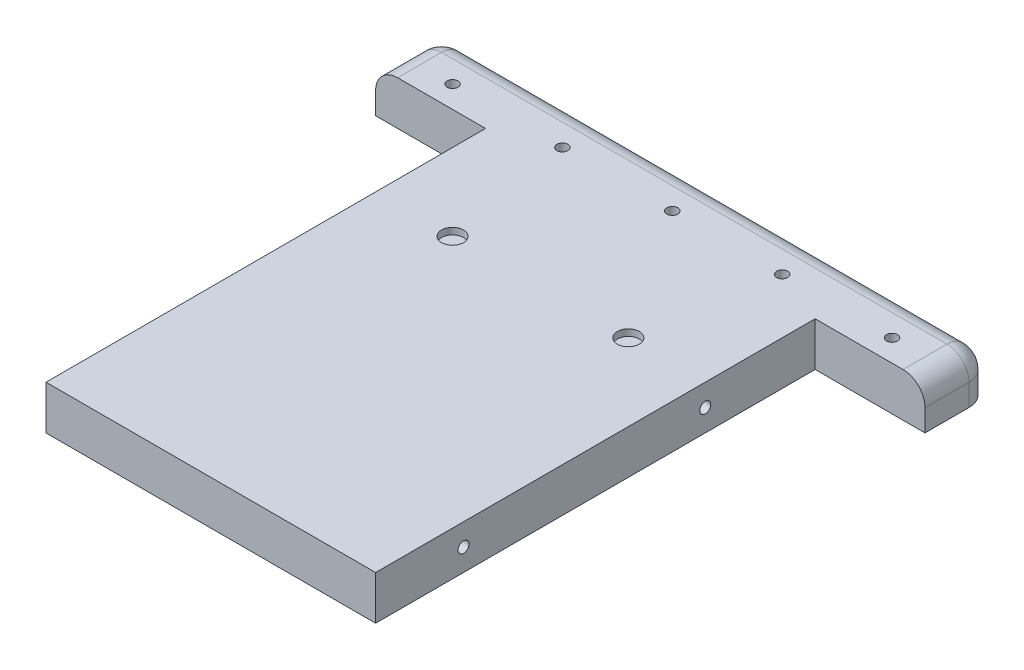
ISO-10303-21;
HEADER;
FILE_DESCRIPTION(('STEP AP214'),'2;1');
FILE_NAME('part.step','',(''),(''),'','','');
FILE_SCHEMA(('AUTOMOTIVE_DESIGN { 1 0 10303 214 1 1 1 1 }'));
ENDSEC;
DATA;
#1=APPLICATION_CONTEXT('core data for automotive mechanical design processes');
#2=APPLICATION_PROTOCOL_DEFINITION('international standard','automotive_design',2000,#1);
#3=PRODUCT_CONTEXT('',#1,'mechanical');
#4=PRODUCT('Part','Part','',(#3));
#5=PRODUCT_RELATED_PRODUCT_CATEGORY('part','',(#4));
#6=PRODUCT_DEFINITION_FORMATION('','',#4);
#7=PRODUCT_DEFINITION_CONTEXT('part definition',#1,'design');
#8=PRODUCT_DEFINITION('design','',#6,#7);
#9=PRODUCT_DEFINITION_SHAPE('','',#8);
#10=(LENGTH_UNIT() NAMED_UNIT(*) SI_UNIT(.MILLI.,.METRE.));
#11=(NAMED_UNIT(*) PLANE_ANGLE_UNIT() SI_UNIT($,.RADIAN.));
#12=(NAMED_UNIT(*) SI_UNIT($,.STERADIAN.) SOLID_ANGLE_UNIT());
#13=UNCERTAINTY_MEASURE_WITH_UNIT(LENGTH_MEASURE(1.E-05),#10,'distance_accuracy_value','');
#14=(GEOMETRIC_REPRESENTATION_CONTEXT(3) GLOBAL_UNCERTAINTY_ASSIGNED_CONTEXT((#13)) GLOBAL_UNIT_ASSIGNED_CONTEXT((#10,
#11,#12)) REPRESENTATION_CONTEXT('',''));
#15=CARTESIAN_POINT('',(0.,0.,0.));
#16=DIRECTION('',(0.,0.,1.));
#17=DIRECTION('',(1.,0.,0.));
#18=AXIS2_PLACEMENT_3D('',#15,#16,#17);
#19=CARTESIAN_POINT('',(-75.,20.,-100.));
#20=DIRECTION('',(1.,0.,0.));
#21=DIRECTION('',(0.,0.,-1.));
#22=AXIS2_PLACEMENT_3D('',#19,#20,#21);
#23=PLANE('',#22);
#24=CARTESIAN_POINT('',(-75.,10.,60.));
#25=DIRECTION('',(-1.,0.,0.));
#26=DIRECTION('',(0.,0.,1.));
#27=AXIS2_PLACEMENT_3D('',#24,#25,#26);
#28=CIRCLE('',#27,2.49999999999999);
#29=CARTESIAN_POINT('',(-75.,10.,62.5));
#30=VERTEX_POINT('',#29);
#31=EDGE_CURVE('E162',#30,#30,#28,.T.);
#32=ORIENTED_EDGE('',*,*,#31,.F.);
#33=EDGE_LOOP('',(#32));
#34=FACE_BOUND('',#33,.T.);
#35=CARTESIAN_POINT('',(-75.,10.,-50.));
#36=DIRECTION('',(-1.,0.,0.));
#37=DIRECTION('',(0.,0.,1.));
#38=AXIS2_PLACEMENT_3D('',#35,#36,#37);
#39=CIRCLE('',#38,2.49999999999999);
#40=CARTESIAN_POINT('',(-75.,10.,-47.5));
#41=VERTEX_POINT('',#40);
#42=EDGE_CURVE('E219',#41,#41,#39,.T.);
#43=ORIENTED_EDGE('',*,*,#42,.F.);
#44=EDGE_LOOP('',(#43));
#45=FACE_BOUND('',#44,.T.);
#46=DIRECTION('',(0.,0.,1.));
#47=VECTOR('',#46,1.);
#48=CARTESIAN_POINT('',(-75.,0.,-100.));
#49=LINE('',#48,#47);
#50=CARTESIAN_POINT('',(-75.,0.,-100.));
#51=VERTEX_POINT('',#50);
#52=CARTESIAN_POINT('',(-75.,0.,100.));
#53=VERTEX_POINT('',#52);
#54=EDGE_CURVE('E149',#51,#53,#49,.T.);
#55=ORIENTED_EDGE('',*,*,#54,.T.);
#56=DIRECTION('',(0.,-1.,0.));
#57=VECTOR('',#56,1.);
#58=CARTESIAN_POINT('',(-75.,20.,100.));
#59=LINE('',#58,#57);
#60=CARTESIAN_POINT('',(-75.,20.,100.));
#61=VERTEX_POINT('',#60);
#62=EDGE_CURVE('E129',#61,#53,#59,.T.);
#63=ORIENTED_EDGE('',*,*,#62,.F.);
#64=DIRECTION('',(0.,0.,1.));
#65=VECTOR('',#64,1.);
#66=CARTESIAN_POINT('',(-75.,20.,-100.));
#67=LINE('',#66,#65);
#68=CARTESIAN_POINT('',(-75.,20.,-100.));
#69=VERTEX_POINT('',#68);
#70=EDGE_CURVE('E136',#69,#61,#67,.T.);
#71=ORIENTED_EDGE('',*,*,#70,.F.);
#72=DIRECTION('',(0.,-1.,0.));
#73=VECTOR('',#72,1.);
#74=CARTESIAN_POINT('',(-75.,20.,-100.));
#75=LINE('',#74,#73);
#76=EDGE_CURVE('E227',#69,#51,#75,.T.);
#77=ORIENTED_EDGE('',*,*,#76,.T.);
#78=EDGE_LOOP('',(#55,#63,#71,#77));
#79=FACE_BOUND('',#78,.T.);
#80=ADVANCED_FACE('F34',(#34,#45,#79),#23,.F.);
#81=CARTESIAN_POINT('',(-75.,20.,100.));
#82=DIRECTION('',(0.,0.,-1.));
#83=DIRECTION('',(-1.,0.,0.));
#84=AXIS2_PLACEMENT_3D('',#81,#82,#83);
#85=PLANE('',#84);
#86=DIRECTION('',(1.,0.,0.));
#87=VECTOR('',#86,1.);
#88=CARTESIAN_POINT('',(-75.,0.,100.));
#89=LINE('',#88,#87);
#90=CARTESIAN_POINT('',(75.,0.,100.));
#91=VERTEX_POINT('',#90);
#92=EDGE_CURVE('E229',#53,#91,#89,.T.);
#93=ORIENTED_EDGE('',*,*,#92,.T.);
#94=DIRECTION('',(0.,-1.,0.));
#95=VECTOR('',#94,1.);
#96=CARTESIAN_POINT('',(75.,20.,100.));
#97=LINE('',#96,#95);
#98=CARTESIAN_POINT('',(75.,20.,100.));
#99=VERTEX_POINT('',#98);
#100=EDGE_CURVE('E132',#99,#91,#97,.T.);
#101=ORIENTED_EDGE('',*,*,#100,.F.);
#102=DIRECTION('',(1.,0.,0.));
#103=VECTOR('',#102,1.);
#104=CARTESIAN_POINT('',(-75.,20.,100.));
#105=LINE('',#104,#103);
#106=EDGE_CURVE('E125',#61,#99,#105,.T.);
#107=ORIENTED_EDGE('',*,*,#106,.F.);
#108=ORIENTED_EDGE('',*,*,#62,.T.);
#109=EDGE_LOOP('',(#93,#101,#107,#108));
#110=FACE_BOUND('',#109,.T.);
#111=ADVANCED_FACE('F127',(#110),#85,.F.);
#112=CARTESIAN_POINT('',(75.,20.,100.));
#113=DIRECTION('',(-1.,0.,0.));
#114=DIRECTION('',(0.,0.,1.));
#115=AXIS2_PLACEMENT_3D('',#112,#113,#114);
#116=PLANE('',#115);
#117=CARTESIAN_POINT('',(75.,10.,60.));
#118=DIRECTION('',(-1.,0.,0.));
#119=DIRECTION('',(0.,0.,1.));
#120=AXIS2_PLACEMENT_3D('',#117,#118,#119);
#121=CIRCLE('',#120,2.49999999999999);
#122=CARTESIAN_POINT('',(75.,10.,62.5));
#123=VERTEX_POINT('',#122);
#124=EDGE_CURVE('E161',#123,#123,#121,.T.);
#125=ORIENTED_EDGE('',*,*,#124,.T.);
#126=EDGE_LOOP('',(#125));
#127=FACE_BOUND('',#126,.T.);
#128=CARTESIAN_POINT('',(75.,10.,-50.));
#129=DIRECTION('',(-1.,0.,0.));
#130=DIRECTION('',(0.,0.,1.));
#131=AXIS2_PLACEMENT_3D('',#128,#129,#130);
#132=CIRCLE('',#131,2.49999999999999);
#133=CARTESIAN_POINT('',(75.,10.,-47.5));
#134=VERTEX_POINT('',#133);
#135=EDGE_CURVE('E158',#134,#134,#132,.T.);
#136=ORIENTED_EDGE('',*,*,#135,.T.);
#137=EDGE_LOOP('',(#136));
#138=FACE_BOUND('',#137,.T.);
#139=DIRECTION('',(0.,0.,-1.));
#140=VECTOR('',#139,1.);
#141=CARTESIAN_POINT('',(75.,0.,100.));
#142=LINE('',#141,#140);
#143=CARTESIAN_POINT('',(75.,0.,-100.));
#144=VERTEX_POINT('',#143);
#145=EDGE_CURVE('E231',#91,#144,#142,.T.);
#146=ORIENTED_EDGE('',*,*,#145,.T.);
#147=DIRECTION('',(0.,-1.,0.));
#148=VECTOR('',#147,1.);
#149=CARTESIAN_POINT('',(75.,20.,-100.));
#150=LINE('',#149,#148);
#151=CARTESIAN_POINT('',(75.,20.,-100.));
#152=VERTEX_POINT('',#151);
#153=EDGE_CURVE('E154',#152,#144,#150,.T.);
#154=ORIENTED_EDGE('',*,*,#153,.F.);
#155=DIRECTION('',(0.,0.,-1.));
#156=VECTOR('',#155,1.);
#157=CARTESIAN_POINT('',(75.,20.,100.));
#158=LINE('',#157,#156);
#159=EDGE_CURVE('E135',#99,#152,#158,.T.);
#160=ORIENTED_EDGE('',*,*,#159,.F.);
#161=ORIENTED_EDGE('',*,*,#100,.T.);
#162=EDGE_LOOP('',(#146,#154,#160,#161));
#163=FACE_BOUND('',#162,.T.);
#164=ADVANCED_FACE('F280',(#127,#138,#163),#116,.F.);
#165=CARTESIAN_POINT('',(75.,20.,-100.));
#166=DIRECTION('',(0.,0.,-1.));
#167=DIRECTION('',(-1.,0.,0.));
#168=AXIS2_PLACEMENT_3D('',#165,#166,#167);
#169=PLANE('',#168);
#170=DIRECTION('',(0.,-1.,0.));
#171=VECTOR('',#170,1.);
#172=CARTESIAN_POINT('',(125.,20.,-100.));
#173=LINE('',#172,#171);
#174=CARTESIAN_POINT('',(125.,10.,-100.));
#175=VERTEX_POINT('',#174);
#176=CARTESIAN_POINT('',(125.,0.,-100.));
#177=VERTEX_POINT('',#176);
#178=EDGE_CURVE('E249',#175,#177,#173,.T.);
#179=ORIENTED_EDGE('',*,*,#178,.F.);
#180=CARTESIAN_POINT('',(115.,10.,-100.));
#181=DIRECTION('',(0.,0.,-1.));
#182=DIRECTION('',(-1.,0.,0.));
#183=AXIS2_PLACEMENT_3D('',#180,#181,#182);
#184=CIRCLE('',#183,10.);
#185=CARTESIAN_POINT('',(115.,20.,-100.));
#186=VERTEX_POINT('',#185);
#187=EDGE_CURVE('E184',#175,#186,#184,.F.);
#188=ORIENTED_EDGE('',*,*,#187,.T.);
#189=DIRECTION('',(1.,0.,0.));
#190=VECTOR('',#189,1.);
#191=CARTESIAN_POINT('',(75.,20.,-100.));
#192=LINE('',#191,#190);
#193=EDGE_CURVE('E224',#152,#186,#192,.T.);
#194=ORIENTED_EDGE('',*,*,#193,.F.);
#195=ORIENTED_EDGE('',*,*,#153,.T.);
#196=DIRECTION('',(1.,0.,0.));
#197=VECTOR('',#196,1.);
#198=CARTESIAN_POINT('',(75.,0.,-100.));
#199=LINE('',#198,#197);
#200=EDGE_CURVE('E233',#144,#177,#199,.T.);
#201=ORIENTED_EDGE('',*,*,#200,.T.);
#202=EDGE_LOOP('',(#179,#188,#194,#195,#201));
#203=FACE_BOUND('',#202,.T.);
#204=ADVANCED_FACE('F256',(#203),#169,.F.);
#205=CARTESIAN_POINT('',(125.,20.,-100.));
#206=DIRECTION('',(-1.,0.,0.));
#207=DIRECTION('',(0.,0.,1.));
#208=AXIS2_PLACEMENT_3D('',#205,#206,#207);
#209=PLANE('',#208);
#210=DIRECTION('',(0.,-1.,0.));
#211=VECTOR('',#210,1.);
#212=CARTESIAN_POINT('',(125.,20.,-120.));
#213=LINE('',#212,#211);
#214=CARTESIAN_POINT('',(125.,0.,-120.));
#215=VERTEX_POINT('',#214);
#216=CARTESIAN_POINT('',(125.,10.,-120.));
#217=VERTEX_POINT('',#216);
#218=EDGE_CURVE('E170',#215,#217,#213,.F.);
#219=ORIENTED_EDGE('',*,*,#218,.T.);
#220=DIRECTION('',(0.,0.,-1.));
#221=VECTOR('',#220,1.);
#222=CARTESIAN_POINT('',(125.,10.,-100.));
#223=LINE('',#222,#221);
#224=EDGE_CURVE('E182',#217,#175,#223,.F.);
#225=ORIENTED_EDGE('',*,*,#224,.T.);
#226=ORIENTED_EDGE('',*,*,#178,.T.);
#227=DIRECTION('',(0.,0.,-1.));
#228=VECTOR('',#227,1.);
#229=CARTESIAN_POINT('',(125.,0.,-100.));
#230=LINE('',#229,#228);
#231=EDGE_CURVE('E236',#177,#215,#230,.T.);
#232=ORIENTED_EDGE('',*,*,#231,.T.);
#233=EDGE_LOOP('',(#219,#225,#226,#232));
#234=FACE_BOUND('',#233,.T.);
#235=ADVANCED_FACE('F266',(#234),#209,.F.);
#236=CARTESIAN_POINT('',(125.,20.,-130.));
#237=DIRECTION('',(0.,0.,1.));
#238=DIRECTION('',(1.,0.,0.));
#239=AXIS2_PLACEMENT_3D('',#236,#237,#238);
#240=PLANE('',#239);
#241=DIRECTION('',(0.,-1.,0.));
#242=VECTOR('',#241,1.);
#243=CARTESIAN_POINT('',(-115.,20.,-130.));
#244=LINE('',#243,#242);
#245=CARTESIAN_POINT('',(-115.,0.,-130.));
#246=VERTEX_POINT('',#245);
#247=CARTESIAN_POINT('',(-115.,10.,-130.));
#248=VERTEX_POINT('',#247);
#249=EDGE_CURVE('E150',#246,#248,#244,.F.);
#250=ORIENTED_EDGE('',*,*,#249,.T.);
#251=DIRECTION('',(-1.,0.,0.));
#252=VECTOR('',#251,1.);
#253=CARTESIAN_POINT('',(115.,10.,-130.));
#254=LINE('',#253,#252);
#255=CARTESIAN_POINT('',(115.,10.,-130.));
#256=VERTEX_POINT('',#255);
#257=EDGE_CURVE('E11',#248,#256,#254,.F.);
#258=ORIENTED_EDGE('',*,*,#257,.T.);
#259=DIRECTION('',(0.,-1.,0.));
#260=VECTOR('',#259,1.);
#261=CARTESIAN_POINT('',(115.,20.,-130.));
#262=LINE('',#261,#260);
#263=CARTESIAN_POINT('',(115.,0.,-130.));
#264=VERTEX_POINT('',#263);
#265=EDGE_CURVE('E152',#256,#264,#262,.T.);
#266=ORIENTED_EDGE('',*,*,#265,.T.);
#267=DIRECTION('',(-1.,0.,0.));
#268=VECTOR('',#267,1.);
#269=CARTESIAN_POINT('',(125.,0.,-130.));
#270=LINE('',#269,#268);
#271=EDGE_CURVE('E239',#264,#246,#270,.T.);
#272=ORIENTED_EDGE('',*,*,#271,.T.);
#273=EDGE_LOOP('',(#250,#258,#266,#272));
#274=FACE_BOUND('',#273,.T.);
#275=ADVANCED_FACE('F319',(#274),#240,.F.);
#276=CARTESIAN_POINT('',(-125.,20.,-130.));
#277=DIRECTION('',(1.,0.,0.));
#278=DIRECTION('',(0.,0.,-1.));
#279=AXIS2_PLACEMENT_3D('',#276,#277,#278);
#280=PLANE('',#279);
#281=DIRECTION('',(0.,-1.,0.));
#282=VECTOR('',#281,1.);
#283=CARTESIAN_POINT('',(-125.,20.,-100.));
#284=LINE('',#283,#282);
#285=CARTESIAN_POINT('',(-125.,10.,-100.));
#286=VERTEX_POINT('',#285);
#287=CARTESIAN_POINT('',(-125.,0.,-100.));
#288=VERTEX_POINT('',#287);
#289=EDGE_CURVE('E247',#286,#288,#284,.T.);
#290=ORIENTED_EDGE('',*,*,#289,.F.);
#291=DIRECTION('',(0.,0.,1.));
#292=VECTOR('',#291,1.);
#293=CARTESIAN_POINT('',(-125.,10.,-120.));
#294=LINE('',#293,#292);
#295=CARTESIAN_POINT('',(-125.,10.,-120.));
#296=VERTEX_POINT('',#295);
#297=EDGE_CURVE('E58',#286,#296,#294,.F.);
#298=ORIENTED_EDGE('',*,*,#297,.T.);
#299=DIRECTION('',(0.,-1.,0.));
#300=VECTOR('',#299,1.);
#301=CARTESIAN_POINT('',(-125.,20.,-120.));
#302=LINE('',#301,#300);
#303=CARTESIAN_POINT('',(-125.,0.,-120.));
#304=VERTEX_POINT('',#303);
#305=EDGE_CURVE('E173',#296,#304,#302,.T.);
#306=ORIENTED_EDGE('',*,*,#305,.T.);
#307=DIRECTION('',(0.,0.,1.));
#308=VECTOR('',#307,1.);
#309=CARTESIAN_POINT('',(-125.,0.,-130.));
#310=LINE('',#309,#308);
#311=EDGE_CURVE('E242',#304,#288,#310,.T.);
#312=ORIENTED_EDGE('',*,*,#311,.T.);
#313=EDGE_LOOP('',(#290,#298,#306,#312));
#314=FACE_BOUND('',#313,.T.);
#315=ADVANCED_FACE('F323',(#314),#280,.F.);
#316=CARTESIAN_POINT('',(-125.,20.,-100.));
#317=DIRECTION('',(0.,0.,-1.));
#318=DIRECTION('',(-1.,0.,0.));
#319=AXIS2_PLACEMENT_3D('',#316,#317,#318);
#320=PLANE('',#319);
#321=DIRECTION('',(1.,0.,0.));
#322=VECTOR('',#321,1.);
#323=CARTESIAN_POINT('',(-125.,20.,-100.));
#324=LINE('',#323,#322);
#325=CARTESIAN_POINT('',(-115.,20.,-100.));
#326=VERTEX_POINT('',#325);
#327=EDGE_CURVE('E142',#326,#69,#324,.T.);
#328=ORIENTED_EDGE('',*,*,#327,.F.);
#329=CARTESIAN_POINT('',(-115.,10.,-100.));
#330=DIRECTION('',(0.,0.,-1.));
#331=DIRECTION('',(-1.,0.,0.));
#332=AXIS2_PLACEMENT_3D('',#329,#330,#331);
#333=CIRCLE('',#332,10.);
#334=EDGE_CURVE('E188',#326,#286,#333,.F.);
#335=ORIENTED_EDGE('',*,*,#334,.T.);
#336=ORIENTED_EDGE('',*,*,#289,.T.);
#337=DIRECTION('',(1.,0.,0.));
#338=VECTOR('',#337,1.);
#339=CARTESIAN_POINT('',(-125.,0.,-100.));
#340=LINE('',#339,#338);
#341=EDGE_CURVE('E146',#288,#51,#340,.T.);
#342=ORIENTED_EDGE('',*,*,#341,.T.);
#343=ORIENTED_EDGE('',*,*,#76,.F.);
#344=EDGE_LOOP('',(#328,#335,#336,#342,#343));
#345=FACE_BOUND('',#344,.T.);
#346=ADVANCED_FACE('F327',(#345),#320,.F.);
#347=CARTESIAN_POINT('',(0.,20.,0.));
#348=DIRECTION('',(0.,1.,0.));
#349=DIRECTION('',(0.,0.,1.));
#350=AXIS2_PLACEMENT_3D('',#347,#348,#349);
#351=PLANE('',#350);
#352=CARTESIAN_POINT('',(-40.,20.,-50.));
#353=DIRECTION('',(0.,1.,0.));
#354=DIRECTION('',(0.,0.,1.));
#355=AXIS2_PLACEMENT_3D('',#352,#353,#354);
#356=CIRCLE('',#355,5.);
#357=CARTESIAN_POINT('',(-40.,20.,-45.));
#358=VERTEX_POINT('',#357);
#359=EDGE_CURVE('E675',#358,#358,#356,.T.);
#360=ORIENTED_EDGE('',*,*,#359,.F.);
#361=EDGE_LOOP('',(#360));
#362=FACE_BOUND('',#361,.T.);
#363=CARTESIAN_POINT('',(40.,20.,-50.));
#364=DIRECTION('',(0.,1.,0.));
#365=DIRECTION('',(0.,0.,-1.));
#366=AXIS2_PLACEMENT_3D('',#363,#364,#365);
#367=CIRCLE('',#366,5.);
#368=CARTESIAN_POINT('',(40.,20.,-55.));
#369=VERTEX_POINT('',#368);
#370=EDGE_CURVE('E669',#369,#369,#367,.T.);
#371=ORIENTED_EDGE('',*,*,#370,.F.);
#372=EDGE_LOOP('',(#371));
#373=FACE_BOUND('',#372,.T.);
#374=CARTESIAN_POINT('',(-100.,20.,-110.));
#375=DIRECTION('',(0.,1.,0.));
#376=DIRECTION('',(0.,0.,-1.));
#377=AXIS2_PLACEMENT_3D('',#374,#375,#376);
#378=CIRCLE('',#377,2.50000000000001);
#379=CARTESIAN_POINT('',(-100.,20.,-112.5));
#380=VERTEX_POINT('',#379);
#381=EDGE_CURVE('E645',#380,#380,#378,.T.);
#382=ORIENTED_EDGE('',*,*,#381,.F.);
#383=EDGE_LOOP('',(#382));
#384=FACE_BOUND('',#383,.T.);
#385=CARTESIAN_POINT('',(-50.,20.,-110.));
#386=DIRECTION('',(0.,1.,0.));
#387=DIRECTION('',(0.,0.,-1.));
#388=AXIS2_PLACEMENT_3D('',#385,#386,#387);
#389=CIRCLE('',#388,2.5);
#390=CARTESIAN_POINT('',(-50.,20.,-112.5));
#391=VERTEX_POINT('',#390);
#392=EDGE_CURVE('E652',#391,#391,#389,.T.);
#393=ORIENTED_EDGE('',*,*,#392,.F.);
#394=EDGE_LOOP('',(#393));
#395=FACE_BOUND('',#394,.T.);
#396=CARTESIAN_POINT('',(100.,20.,-110.));
#397=DIRECTION('',(0.,1.,0.));
#398=DIRECTION('',(0.,0.,1.));
#399=AXIS2_PLACEMENT_3D('',#396,#397,#398);
#400=CIRCLE('',#399,2.50000000000001);
#401=CARTESIAN_POINT('',(100.,20.,-107.5));
#402=VERTEX_POINT('',#401);
#403=EDGE_CURVE('E658',#402,#402,#400,.T.);
#404=ORIENTED_EDGE('',*,*,#403,.F.);
#405=EDGE_LOOP('',(#404));
#406=FACE_BOUND('',#405,.T.);
#407=CARTESIAN_POINT('',(50.,20.,-110.));
#408=DIRECTION('',(0.,1.,0.));
#409=DIRECTION('',(0.,0.,1.));
#410=AXIS2_PLACEMENT_3D('',#407,#408,#409);
#411=CIRCLE('',#410,2.5);
#412=CARTESIAN_POINT('',(50.,20.,-107.5));
#413=VERTEX_POINT('',#412);
#414=EDGE_CURVE('E664',#413,#413,#411,.T.);
#415=ORIENTED_EDGE('',*,*,#414,.F.);
#416=EDGE_LOOP('',(#415));
#417=FACE_BOUND('',#416,.T.);
#418=CARTESIAN_POINT('',(0.,20.,-110.));
#419=DIRECTION('',(0.,1.,0.));
#420=DIRECTION('',(0.,0.,1.));
#421=AXIS2_PLACEMENT_3D('',#418,#419,#420);
#422=CIRCLE('',#421,2.5);
#423=CARTESIAN_POINT('',(0.,20.,-107.5));
#424=VERTEX_POINT('',#423);
#425=EDGE_CURVE('E639',#424,#424,#422,.T.);
#426=ORIENTED_EDGE('',*,*,#425,.F.);
#427=EDGE_LOOP('',(#426));
#428=FACE_BOUND('',#427,.T.);
#429=ORIENTED_EDGE('',*,*,#193,.T.);
#430=DIRECTION('',(0.,0.,-1.));
#431=VECTOR('',#430,1.);
#432=CARTESIAN_POINT('',(115.,20.,-120.));
#433=LINE('',#432,#431);
#434=CARTESIAN_POINT('',(115.,20.,-120.));
#435=VERTEX_POINT('',#434);
#436=EDGE_CURVE('E179',#186,#435,#433,.T.);
#437=ORIENTED_EDGE('',*,*,#436,.T.);
#438=DIRECTION('',(-1.,0.,0.));
#439=VECTOR('',#438,1.);
#440=CARTESIAN_POINT('',(-115.,20.,-120.));
#441=LINE('',#440,#439);
#442=CARTESIAN_POINT('',(-115.,20.,-120.));
#443=VERTEX_POINT('',#442);
#444=EDGE_CURVE('E175',#435,#443,#441,.T.);
#445=ORIENTED_EDGE('',*,*,#444,.T.);
#446=DIRECTION('',(0.,0.,1.));
#447=VECTOR('',#446,1.);
#448=CARTESIAN_POINT('',(-115.,20.,-100.));
#449=LINE('',#448,#447);
#450=EDGE_CURVE('E177',#443,#326,#449,.T.);
#451=ORIENTED_EDGE('',*,*,#450,.T.);
#452=ORIENTED_EDGE('',*,*,#327,.T.);
#453=ORIENTED_EDGE('',*,*,#70,.T.);
#454=ORIENTED_EDGE('',*,*,#106,.T.);
#455=ORIENTED_EDGE('',*,*,#159,.T.);
#456=EDGE_LOOP('',(#429,#437,#445,#451,#452,#453,#454,#455));
#457=FACE_BOUND('',#456,.T.);
#458=ADVANCED_FACE('F140',(#362,#373,#384,#395,#406,#417,#428,#457),#351,.T.);
#459=CARTESIAN_POINT('',(0.,0.,0.));
#460=DIRECTION('',(0.,1.,0.));
#461=DIRECTION('',(0.,0.,1.));
#462=AXIS2_PLACEMENT_3D('',#459,#460,#461);
#463=PLANE('',#462);
#464=CARTESIAN_POINT('',(-100.,0.,-115.));
#465=DIRECTION('',(0.,-1.,0.));
#466=DIRECTION('',(0.,0.,-1.));
#467=AXIS2_PLACEMENT_3D('',#464,#465,#466);
#468=CIRCLE('',#467,2.5);
#469=CARTESIAN_POINT('',(-100.,0.,-117.5));
#470=VERTEX_POINT('',#469);
#471=EDGE_CURVE('E611',#470,#470,#468,.T.);
#472=ORIENTED_EDGE('',*,*,#471,.F.);
#473=EDGE_LOOP('',(#472));
#474=FACE_BOUND('',#473,.T.);
#475=CARTESIAN_POINT('',(-50.,0.,-115.));
#476=DIRECTION('',(0.,-1.,0.));
#477=DIRECTION('',(0.,0.,-1.));
#478=AXIS2_PLACEMENT_3D('',#475,#476,#477);
#479=CIRCLE('',#478,2.5);
#480=CARTESIAN_POINT('',(-50.,0.,-117.5));
#481=VERTEX_POINT('',#480);
#482=EDGE_CURVE('E615',#481,#481,#479,.T.);
#483=ORIENTED_EDGE('',*,*,#482,.F.);
#484=EDGE_LOOP('',(#483));
#485=FACE_BOUND('',#484,.T.);
#486=CARTESIAN_POINT('',(0.,0.,-115.));
#487=DIRECTION('',(0.,-1.,0.));
#488=DIRECTION('',(0.,0.,-1.));
#489=AXIS2_PLACEMENT_3D('',#486,#487,#488);
#490=CIRCLE('',#489,2.5);
#491=CARTESIAN_POINT('',(0.,0.,-117.5));
#492=VERTEX_POINT('',#491);
#493=EDGE_CURVE('E619',#492,#492,#490,.T.);
#494=ORIENTED_EDGE('',*,*,#493,.F.);
#495=EDGE_LOOP('',(#494));
#496=FACE_BOUND('',#495,.T.);
#497=CARTESIAN_POINT('',(50.,0.,-115.));
#498=DIRECTION('',(0.,-1.,0.));
#499=DIRECTION('',(0.,0.,1.));
#500=AXIS2_PLACEMENT_3D('',#497,#498,#499);
#501=CIRCLE('',#500,2.5);
#502=CARTESIAN_POINT('',(50.,0.,-112.5));
#503=VERTEX_POINT('',#502);
#504=EDGE_CURVE('E213',#503,#503,#501,.T.);
#505=ORIENTED_EDGE('',*,*,#504,.F.);
#506=EDGE_LOOP('',(#505));
#507=FACE_BOUND('',#506,.T.);
#508=CARTESIAN_POINT('',(100.,0.,-115.));
#509=DIRECTION('',(0.,-1.,0.));
#510=DIRECTION('',(0.,0.,1.));
#511=AXIS2_PLACEMENT_3D('',#508,#509,#510);
#512=CIRCLE('',#511,2.5);
#513=CARTESIAN_POINT('',(100.,0.,-112.5));
#514=VERTEX_POINT('',#513);
#515=EDGE_CURVE('E204',#514,#514,#512,.T.);
#516=ORIENTED_EDGE('',*,*,#515,.F.);
#517=EDGE_LOOP('',(#516));
#518=FACE_BOUND('',#517,.T.);
#519=ORIENTED_EDGE('',*,*,#271,.F.);
#520=CARTESIAN_POINT('',(115.,0.,-120.));
#521=DIRECTION('',(0.,1.,0.));
#522=DIRECTION('',(0.,0.,1.));
#523=AXIS2_PLACEMENT_3D('',#520,#521,#522);
#524=CIRCLE('',#523,10.);
#525=EDGE_CURVE('E168',#264,#215,#524,.F.);
#526=ORIENTED_EDGE('',*,*,#525,.T.);
#527=ORIENTED_EDGE('',*,*,#231,.F.);
#528=ORIENTED_EDGE('',*,*,#200,.F.);
#529=ORIENTED_EDGE('',*,*,#145,.F.);
#530=ORIENTED_EDGE('',*,*,#92,.F.);
#531=ORIENTED_EDGE('',*,*,#54,.F.);
#532=ORIENTED_EDGE('',*,*,#341,.F.);
#533=ORIENTED_EDGE('',*,*,#311,.F.);
#534=CARTESIAN_POINT('',(-115.,0.,-120.));
#535=DIRECTION('',(0.,1.,0.));
#536=DIRECTION('',(0.,0.,1.));
#537=AXIS2_PLACEMENT_3D('',#534,#535,#536);
#538=CIRCLE('',#537,10.);
#539=EDGE_CURVE('E166',#304,#246,#538,.F.);
#540=ORIENTED_EDGE('',*,*,#539,.T.);
#541=EDGE_LOOP('',(#519,#526,#527,#528,#529,#530,#531,#532,#533,#540));
#542=FACE_BOUND('',#541,.T.);
#543=ADVANCED_FACE('F262',(#474,#485,#496,#507,#518,#542),#463,.F.);
#544=CARTESIAN_POINT('',(125.,10.,-50.));
#545=DIRECTION('',(-1.,0.,0.));
#546=DIRECTION('',(0.,0.,1.));
#547=AXIS2_PLACEMENT_3D('',#544,#545,#546);
#548=CYLINDRICAL_SURFACE('',#547,2.49999999999999);
#549=ORIENTED_EDGE('',*,*,#42,.T.);
#550=EDGE_LOOP('',(#549));
#551=FACE_BOUND('',#550,.T.);
#552=ORIENTED_EDGE('',*,*,#135,.F.);
#553=EDGE_LOOP('',(#552));
#554=FACE_BOUND('',#553,.T.);
#555=ADVANCED_FACE('F596',(#551,#554),#548,.F.);
#556=CARTESIAN_POINT('',(125.,10.,60.));
#557=DIRECTION('',(-1.,0.,0.));
#558=DIRECTION('',(0.,0.,1.));
#559=AXIS2_PLACEMENT_3D('',#556,#557,#558);
#560=CYLINDRICAL_SURFACE('',#559,2.49999999999999);
#561=ORIENTED_EDGE('',*,*,#31,.T.);
#562=EDGE_LOOP('',(#561));
#563=FACE_BOUND('',#562,.T.);
#564=ORIENTED_EDGE('',*,*,#124,.F.);
#565=EDGE_LOOP('',(#564));
#566=FACE_BOUND('',#565,.T.);
#567=ADVANCED_FACE('F592',(#563,#566),#560,.F.);
#568=CARTESIAN_POINT('',(100.,5.,-115.));
#569=DIRECTION('',(0.,-1.,0.));
#570=DIRECTION('',(0.,0.,-1.));
#571=AXIS2_PLACEMENT_3D('',#568,#569,#570);
#572=CYLINDRICAL_SURFACE('',#571,2.5);
#573=CARTESIAN_POINT('',(100.,5.,-115.));
#574=DIRECTION('',(0.,-1.,0.));
#575=DIRECTION('',(0.,0.,1.));
#576=AXIS2_PLACEMENT_3D('',#573,#574,#575);
#577=CIRCLE('',#576,2.5);
#578=CARTESIAN_POINT('',(100.,5.,-112.5));
#579=VERTEX_POINT('',#578);
#580=EDGE_CURVE('E208',#579,#579,#577,.T.);
#581=ORIENTED_EDGE('',*,*,#580,.F.);
#582=EDGE_LOOP('',(#581));
#583=FACE_BOUND('',#582,.T.);
#584=ORIENTED_EDGE('',*,*,#515,.T.);
#585=EDGE_LOOP('',(#584));
#586=FACE_BOUND('',#585,.T.);
#587=ADVANCED_FACE('F588',(#583,#586),#572,.F.);
#588=CARTESIAN_POINT('',(100.,5.,-115.));
#589=DIRECTION('',(0.,1.,0.));
#590=DIRECTION('',(0.,0.,1.));
#591=AXIS2_PLACEMENT_3D('',#588,#589,#590);
#592=PLANE('',#591);
#593=ORIENTED_EDGE('',*,*,#580,.T.);
#594=EDGE_LOOP('',(#593));
#595=FACE_BOUND('',#594,.T.);
#596=ADVANCED_FACE('F584',(#595),#592,.F.);
#597=CARTESIAN_POINT('',(50.,5.,-115.));
#598=DIRECTION('',(0.,-1.,0.));
#599=DIRECTION('',(0.,0.,-1.));
#600=AXIS2_PLACEMENT_3D('',#597,#598,#599);
#601=CYLINDRICAL_SURFACE('',#600,2.5);
#602=CARTESIAN_POINT('',(50.,5.,-115.));
#603=DIRECTION('',(0.,-1.,0.));
#604=DIRECTION('',(0.,0.,1.));
#605=AXIS2_PLACEMENT_3D('',#602,#603,#604);
#606=CIRCLE('',#605,2.5);
#607=CARTESIAN_POINT('',(50.,5.,-112.5));
#608=VERTEX_POINT('',#607);
#609=EDGE_CURVE('E624',#608,#608,#606,.T.);
#610=ORIENTED_EDGE('',*,*,#609,.F.);
#611=EDGE_LOOP('',(#610));
#612=FACE_BOUND('',#611,.T.);
#613=ORIENTED_EDGE('',*,*,#504,.T.);
#614=EDGE_LOOP('',(#613));
#615=FACE_BOUND('',#614,.T.);
#616=ADVANCED_FACE('F580',(#612,#615),#601,.F.);
#617=CARTESIAN_POINT('',(50.,5.,-115.));
#618=DIRECTION('',(0.,1.,0.));
#619=DIRECTION('',(0.,0.,1.));
#620=AXIS2_PLACEMENT_3D('',#617,#618,#619);
#621=PLANE('',#620);
#622=ORIENTED_EDGE('',*,*,#609,.T.);
#623=EDGE_LOOP('',(#622));
#624=FACE_BOUND('',#623,.T.);
#625=ADVANCED_FACE('F576',(#624),#621,.F.);
#626=CARTESIAN_POINT('',(0.,5.,-115.));
#627=DIRECTION('',(0.,-1.,0.));
#628=DIRECTION('',(0.,0.,-1.));
#629=AXIS2_PLACEMENT_3D('',#626,#627,#628);
#630=CYLINDRICAL_SURFACE('',#629,2.5);
#631=CARTESIAN_POINT('',(0.,5.,-115.));
#632=DIRECTION('',(0.,-1.,0.));
#633=DIRECTION('',(0.,0.,-1.));
#634=AXIS2_PLACEMENT_3D('',#631,#632,#633);
#635=CIRCLE('',#634,2.5);
#636=CARTESIAN_POINT('',(0.,5.,-117.5));
#637=VERTEX_POINT('',#636);
#638=EDGE_CURVE('E629',#637,#637,#635,.T.);
#639=ORIENTED_EDGE('',*,*,#638,.F.);
#640=EDGE_LOOP('',(#639));
#641=FACE_BOUND('',#640,.T.);
#642=ORIENTED_EDGE('',*,*,#493,.T.);
#643=EDGE_LOOP('',(#642));
#644=FACE_BOUND('',#643,.T.);
#645=ADVANCED_FACE('F572',(#641,#644),#630,.F.);
#646=CARTESIAN_POINT('',(0.,5.,-115.));
#647=DIRECTION('',(0.,-1.,0.));
#648=DIRECTION('',(0.,0.,-1.));
#649=AXIS2_PLACEMENT_3D('',#646,#647,#648);
#650=PLANE('',#649);
#651=ORIENTED_EDGE('',*,*,#638,.T.);
#652=EDGE_LOOP('',(#651));
#653=FACE_BOUND('',#652,.T.);
#654=ADVANCED_FACE('F568',(#653),#650,.T.);
#655=CARTESIAN_POINT('',(-50.,5.,-115.));
#656=DIRECTION('',(0.,-1.,0.));
#657=DIRECTION('',(0.,0.,-1.));
#658=AXIS2_PLACEMENT_3D('',#655,#656,#657);
#659=CYLINDRICAL_SURFACE('',#658,2.5);
#660=CARTESIAN_POINT('',(-50.,5.,-115.));
#661=DIRECTION('',(0.,-1.,0.));
#662=DIRECTION('',(0.,0.,-1.));
#663=AXIS2_PLACEMENT_3D('',#660,#661,#662);
#664=CIRCLE('',#663,2.5);
#665=CARTESIAN_POINT('',(-50.,5.,-117.5));
#666=VERTEX_POINT('',#665);
#667=EDGE_CURVE('E633',#666,#666,#664,.T.);
#668=ORIENTED_EDGE('',*,*,#667,.F.);
#669=EDGE_LOOP('',(#668));
#670=FACE_BOUND('',#669,.T.);
#671=ORIENTED_EDGE('',*,*,#482,.T.);
#672=EDGE_LOOP('',(#671));
#673=FACE_BOUND('',#672,.T.);
#674=ADVANCED_FACE('F564',(#670,#673),#659,.F.);
#675=CARTESIAN_POINT('',(-50.,5.,-115.));
#676=DIRECTION('',(0.,-1.,0.));
#677=DIRECTION('',(0.,0.,-1.));
#678=AXIS2_PLACEMENT_3D('',#675,#676,#677);
#679=PLANE('',#678);
#680=ORIENTED_EDGE('',*,*,#667,.T.);
#681=EDGE_LOOP('',(#680));
#682=FACE_BOUND('',#681,.T.);
#683=ADVANCED_FACE('F560',(#682),#679,.T.);
#684=CARTESIAN_POINT('',(-100.,5.,-115.));
#685=DIRECTION('',(0.,-1.,0.));
#686=DIRECTION('',(0.,0.,-1.));
#687=AXIS2_PLACEMENT_3D('',#684,#685,#686);
#688=CYLINDRICAL_SURFACE('',#687,2.5);
#689=CARTESIAN_POINT('',(-100.,5.,-115.));
#690=DIRECTION('',(0.,-1.,0.));
#691=DIRECTION('',(0.,0.,-1.));
#692=AXIS2_PLACEMENT_3D('',#689,#690,#691);
#693=CIRCLE('',#692,2.5);
#694=CARTESIAN_POINT('',(-100.,5.,-117.5));
#695=VERTEX_POINT('',#694);
#696=EDGE_CURVE('E221',#695,#695,#693,.T.);
#697=ORIENTED_EDGE('',*,*,#696,.F.);
#698=EDGE_LOOP('',(#697));
#699=FACE_BOUND('',#698,.T.);
#700=ORIENTED_EDGE('',*,*,#471,.T.);
#701=EDGE_LOOP('',(#700));
#702=FACE_BOUND('',#701,.T.);
#703=ADVANCED_FACE('F556',(#699,#702),#688,.F.);
#704=CARTESIAN_POINT('',(-100.,5.,-115.));
#705=DIRECTION('',(0.,-1.,0.));
#706=DIRECTION('',(0.,0.,-1.));
#707=AXIS2_PLACEMENT_3D('',#704,#705,#706);
#708=PLANE('',#707);
#709=ORIENTED_EDGE('',*,*,#696,.T.);
#710=EDGE_LOOP('',(#709));
#711=FACE_BOUND('',#710,.T.);
#712=ADVANCED_FACE('F302',(#711),#708,.T.);
#713=CARTESIAN_POINT('',(115.,20.,-120.));
#714=DIRECTION('',(0.,-1.,0.));
#715=DIRECTION('',(0.,0.,-1.));
#716=AXIS2_PLACEMENT_3D('',#713,#714,#715);
#717=CYLINDRICAL_SURFACE('',#716,10.);
#718=ORIENTED_EDGE('',*,*,#265,.F.);
#719=CARTESIAN_POINT('',(115.,10.,-120.));
#720=DIRECTION('',(0.,-1.,0.));
#721=DIRECTION('',(0.,0.,-1.));
#722=AXIS2_PLACEMENT_3D('',#719,#720,#721);
#723=CIRCLE('',#722,10.);
#724=EDGE_CURVE('E186',#256,#217,#723,.T.);
#725=ORIENTED_EDGE('',*,*,#724,.T.);
#726=ORIENTED_EDGE('',*,*,#218,.F.);
#727=ORIENTED_EDGE('',*,*,#525,.F.);
#728=EDGE_LOOP('',(#718,#725,#726,#727));
#729=FACE_BOUND('',#728,.T.);
#730=ADVANCED_FACE('F270',(#729),#717,.T.);
#731=CARTESIAN_POINT('',(-115.,20.,-120.));
#732=DIRECTION('',(0.,-1.,0.));
#733=DIRECTION('',(0.,0.,-1.));
#734=AXIS2_PLACEMENT_3D('',#731,#732,#733);
#735=CYLINDRICAL_SURFACE('',#734,10.);
#736=ORIENTED_EDGE('',*,*,#305,.F.);
#737=CARTESIAN_POINT('',(-115.,10.,-120.));
#738=DIRECTION('',(0.,-1.,0.));
#739=DIRECTION('',(0.,0.,-1.));
#740=AXIS2_PLACEMENT_3D('',#737,#738,#739);
#741=CIRCLE('',#740,10.);
#742=EDGE_CURVE('E43',#296,#248,#741,.T.);
#743=ORIENTED_EDGE('',*,*,#742,.T.);
#744=ORIENTED_EDGE('',*,*,#249,.F.);
#745=ORIENTED_EDGE('',*,*,#539,.F.);
#746=EDGE_LOOP('',(#736,#743,#744,#745));
#747=FACE_BOUND('',#746,.T.);
#748=ADVANCED_FACE('F301',(#747),#735,.T.);
#749=CARTESIAN_POINT('',(-115.,10.,0.));
#750=DIRECTION('',(0.,0.,-1.));
#751=DIRECTION('',(-1.,0.,0.));
#752=AXIS2_PLACEMENT_3D('',#749,#750,#751);
#753=CYLINDRICAL_SURFACE('',#752,10.);
#754=CARTESIAN_POINT('',(-115.,10.,-120.));
#755=DIRECTION('',(0.,0.,-1.));
#756=DIRECTION('',(-1.,0.,0.));
#757=AXIS2_PLACEMENT_3D('',#754,#755,#756);
#758=CIRCLE('',#757,10.);
#759=EDGE_CURVE('E38',#296,#443,#758,.T.);
#760=ORIENTED_EDGE('',*,*,#759,.F.);
#761=ORIENTED_EDGE('',*,*,#297,.F.);
#762=ORIENTED_EDGE('',*,*,#334,.F.);
#763=ORIENTED_EDGE('',*,*,#450,.F.);
#764=EDGE_LOOP('',(#760,#761,#762,#763));
#765=FACE_BOUND('',#764,.T.);
#766=ADVANCED_FACE('F36',(#765),#753,.T.);
#767=CARTESIAN_POINT('',(-115.,10.,-120.));
#768=DIRECTION('',(0.,1.,0.));
#769=DIRECTION('',(0.,0.,1.));
#770=AXIS2_PLACEMENT_3D('',#767,#768,#769);
#771=SPHERICAL_SURFACE('',#770,10.);
#772=ORIENTED_EDGE('',*,*,#742,.F.);
#773=ORIENTED_EDGE('',*,*,#759,.T.);
#774=CARTESIAN_POINT('',(-115.,10.,-120.));
#775=DIRECTION('',(1.,0.,0.));
#776=DIRECTION('',(0.,0.,-1.));
#777=AXIS2_PLACEMENT_3D('',#774,#775,#776);
#778=CIRCLE('',#777,10.);
#779=EDGE_CURVE('E197',#248,#443,#778,.T.);
#780=ORIENTED_EDGE('',*,*,#779,.F.);
#781=EDGE_LOOP('',(#772,#773,#780));
#782=FACE_BOUND('',#781,.T.);
#783=ADVANCED_FACE('F312',(#782),#771,.T.);
#784=CARTESIAN_POINT('',(0.,10.,-120.));
#785=DIRECTION('',(1.,0.,0.));
#786=DIRECTION('',(0.,0.,-1.));
#787=AXIS2_PLACEMENT_3D('',#784,#785,#786);
#788=CYLINDRICAL_SURFACE('',#787,10.);
#789=CARTESIAN_POINT('',(115.,10.,-120.));
#790=DIRECTION('',(1.,0.,0.));
#791=DIRECTION('',(0.,0.,-1.));
#792=AXIS2_PLACEMENT_3D('',#789,#790,#791);
#793=CIRCLE('',#792,10.);
#794=EDGE_CURVE('E194',#256,#435,#793,.T.);
#795=ORIENTED_EDGE('',*,*,#794,.F.);
#796=ORIENTED_EDGE('',*,*,#257,.F.);
#797=ORIENTED_EDGE('',*,*,#779,.T.);
#798=ORIENTED_EDGE('',*,*,#444,.F.);
#799=EDGE_LOOP('',(#795,#796,#797,#798));
#800=FACE_BOUND('',#799,.T.);
#801=ADVANCED_FACE('F310',(#800),#788,.T.);
#802=CARTESIAN_POINT('',(115.,10.,-120.));
#803=DIRECTION('',(0.,1.,0.));
#804=DIRECTION('',(0.,0.,1.));
#805=AXIS2_PLACEMENT_3D('',#802,#803,#804);
#806=SPHERICAL_SURFACE('',#805,10.);
#807=ORIENTED_EDGE('',*,*,#724,.F.);
#808=ORIENTED_EDGE('',*,*,#794,.T.);
#809=CARTESIAN_POINT('',(115.,10.,-120.));
#810=DIRECTION('',(0.,0.,1.));
#811=DIRECTION('',(1.,0.,0.));
#812=AXIS2_PLACEMENT_3D('',#809,#810,#811);
#813=CIRCLE('',#812,10.);
#814=EDGE_CURVE('E192',#217,#435,#813,.T.);
#815=ORIENTED_EDGE('',*,*,#814,.F.);
#816=EDGE_LOOP('',(#807,#808,#815));
#817=FACE_BOUND('',#816,.T.);
#818=ADVANCED_FACE('F275',(#817),#806,.T.);
#819=CARTESIAN_POINT('',(115.,10.,1.06396373193244E-13));
#820=DIRECTION('',(0.,0.,1.));
#821=DIRECTION('',(1.,0.,0.));
#822=AXIS2_PLACEMENT_3D('',#819,#820,#821);
#823=CYLINDRICAL_SURFACE('',#822,10.);
#824=ORIENTED_EDGE('',*,*,#187,.F.);
#825=ORIENTED_EDGE('',*,*,#224,.F.);
#826=ORIENTED_EDGE('',*,*,#814,.T.);
#827=ORIENTED_EDGE('',*,*,#436,.F.);
#828=EDGE_LOOP('',(#824,#825,#826,#827));
#829=FACE_BOUND('',#828,.T.);
#830=ADVANCED_FACE('F279',(#829),#823,.T.);
#831=CARTESIAN_POINT('',(0.,15.,-110.));
#832=DIRECTION('',(0.,1.,0.));
#833=DIRECTION('',(0.,0.,1.));
#834=AXIS2_PLACEMENT_3D('',#831,#832,#833);
#835=CYLINDRICAL_SURFACE('',#834,2.5);
#836=CARTESIAN_POINT('',(0.,15.,-110.));
#837=DIRECTION('',(0.,1.,0.));
#838=DIRECTION('',(0.,0.,1.));
#839=AXIS2_PLACEMENT_3D('',#836,#837,#838);
#840=CIRCLE('',#839,2.5);
#841=CARTESIAN_POINT('',(0.,15.,-107.5));
#842=VERTEX_POINT('',#841);
#843=EDGE_CURVE('E195',#842,#842,#840,.T.);
#844=ORIENTED_EDGE('',*,*,#843,.F.);
#845=EDGE_LOOP('',(#844));
#846=FACE_BOUND('',#845,.T.);
#847=ORIENTED_EDGE('',*,*,#425,.T.);
#848=EDGE_LOOP('',(#847));
#849=FACE_BOUND('',#848,.T.);
#850=ADVANCED_FACE('F307',(#846,#849),#835,.F.);
#851=CARTESIAN_POINT('',(0.,15.,-110.));
#852=DIRECTION('',(0.,1.,0.));
#853=DIRECTION('',(0.,0.,1.));
#854=AXIS2_PLACEMENT_3D('',#851,#852,#853);
#855=PLANE('',#854);
#856=ORIENTED_EDGE('',*,*,#843,.T.);
#857=EDGE_LOOP('',(#856));
#858=FACE_BOUND('',#857,.T.);
#859=ADVANCED_FACE('F412',(#858),#855,.T.);
#860=CARTESIAN_POINT('',(50.,15.,-110.));
#861=DIRECTION('',(0.,1.,0.));
#862=DIRECTION('',(0.,0.,1.));
#863=AXIS2_PLACEMENT_3D('',#860,#861,#862);
#864=CYLINDRICAL_SURFACE('',#863,2.5);
#865=CARTESIAN_POINT('',(50.,15.,-110.));
#866=DIRECTION('',(0.,1.,0.));
#867=DIRECTION('',(0.,0.,1.));
#868=AXIS2_PLACEMENT_3D('',#865,#866,#867);
#869=CIRCLE('',#868,2.5);
#870=CARTESIAN_POINT('',(50.,15.,-107.5));
#871=VERTEX_POINT('',#870);
#872=EDGE_CURVE('E642',#871,#871,#869,.T.);
#873=ORIENTED_EDGE('',*,*,#872,.F.);
#874=EDGE_LOOP('',(#873));
#875=FACE_BOUND('',#874,.T.);
#876=ORIENTED_EDGE('',*,*,#414,.T.);
#877=EDGE_LOOP('',(#876));
#878=FACE_BOUND('',#877,.T.);
#879=ADVANCED_FACE('F422',(#875,#878),#864,.F.);
#880=CARTESIAN_POINT('',(50.,15.,-110.));
#881=DIRECTION('',(0.,1.,0.));
#882=DIRECTION('',(0.,0.,1.));
#883=AXIS2_PLACEMENT_3D('',#880,#881,#882);
#884=PLANE('',#883);
#885=ORIENTED_EDGE('',*,*,#872,.T.);
#886=EDGE_LOOP('',(#885));
#887=FACE_BOUND('',#886,.T.);
#888=ADVANCED_FACE('F432',(#887),#884,.T.);
#889=CARTESIAN_POINT('',(100.,15.,-110.));
#890=DIRECTION('',(0.,1.,0.));
#891=DIRECTION('',(0.,0.,1.));
#892=AXIS2_PLACEMENT_3D('',#889,#890,#891);
#893=CYLINDRICAL_SURFACE('',#892,2.50000000000001);
#894=CARTESIAN_POINT('',(100.,15.,-110.));
#895=DIRECTION('',(0.,1.,0.));
#896=DIRECTION('',(0.,0.,1.));
#897=AXIS2_PLACEMENT_3D('',#894,#895,#896);
#898=CIRCLE('',#897,2.50000000000001);
#899=CARTESIAN_POINT('',(100.,15.,-107.5));
#900=VERTEX_POINT('',#899);
#901=EDGE_CURVE('E661',#900,#900,#898,.T.);
#902=ORIENTED_EDGE('',*,*,#901,.F.);
#903=EDGE_LOOP('',(#902));
#904=FACE_BOUND('',#903,.T.);
#905=ORIENTED_EDGE('',*,*,#403,.T.);
#906=EDGE_LOOP('',(#905));
#907=FACE_BOUND('',#906,.T.);
#908=ADVANCED_FACE('F442',(#904,#907),#893,.F.);
#909=CARTESIAN_POINT('',(100.,15.,-110.));
#910=DIRECTION('',(0.,1.,0.));
#911=DIRECTION('',(0.,0.,1.));
#912=AXIS2_PLACEMENT_3D('',#909,#910,#911);
#913=PLANE('',#912);
#914=ORIENTED_EDGE('',*,*,#901,.T.);
#915=EDGE_LOOP('',(#914));
#916=FACE_BOUND('',#915,.T.);
#917=ADVANCED_FACE('F452',(#916),#913,.T.);
#918=CARTESIAN_POINT('',(-50.,15.,-110.));
#919=DIRECTION('',(0.,1.,0.));
#920=DIRECTION('',(0.,0.,1.));
#921=AXIS2_PLACEMENT_3D('',#918,#919,#920);
#922=CYLINDRICAL_SURFACE('',#921,2.5);
#923=CARTESIAN_POINT('',(-50.,15.,-110.));
#924=DIRECTION('',(0.,1.,0.));
#925=DIRECTION('',(0.,0.,-1.));
#926=AXIS2_PLACEMENT_3D('',#923,#924,#925);
#927=CIRCLE('',#926,2.5);
#928=CARTESIAN_POINT('',(-50.,15.,-112.5));
#929=VERTEX_POINT('',#928);
#930=EDGE_CURVE('E655',#929,#929,#927,.T.);
#931=ORIENTED_EDGE('',*,*,#930,.F.);
#932=EDGE_LOOP('',(#931));
#933=FACE_BOUND('',#932,.T.);
#934=ORIENTED_EDGE('',*,*,#392,.T.);
#935=EDGE_LOOP('',(#934));
#936=FACE_BOUND('',#935,.T.);
#937=ADVANCED_FACE('F462',(#933,#936),#922,.F.);
#938=CARTESIAN_POINT('',(-50.,15.,-110.));
#939=DIRECTION('',(0.,-1.,0.));
#940=DIRECTION('',(0.,0.,-1.));
#941=AXIS2_PLACEMENT_3D('',#938,#939,#940);
#942=PLANE('',#941);
#943=ORIENTED_EDGE('',*,*,#930,.T.);
#944=EDGE_LOOP('',(#943));
#945=FACE_BOUND('',#944,.T.);
#946=ADVANCED_FACE('F472',(#945),#942,.F.);
#947=CARTESIAN_POINT('',(-100.,15.,-110.));
#948=DIRECTION('',(0.,1.,0.));
#949=DIRECTION('',(0.,0.,1.));
#950=AXIS2_PLACEMENT_3D('',#947,#948,#949);
#951=CYLINDRICAL_SURFACE('',#950,2.50000000000001);
#952=CARTESIAN_POINT('',(-100.,15.,-110.));
#953=DIRECTION('',(0.,1.,0.));
#954=DIRECTION('',(0.,0.,-1.));
#955=AXIS2_PLACEMENT_3D('',#952,#953,#954);
#956=CIRCLE('',#955,2.50000000000001);
#957=CARTESIAN_POINT('',(-100.,15.,-112.5));
#958=VERTEX_POINT('',#957);
#959=EDGE_CURVE('E648',#958,#958,#956,.T.);
#960=ORIENTED_EDGE('',*,*,#959,.F.);
#961=EDGE_LOOP('',(#960));
#962=FACE_BOUND('',#961,.T.);
#963=ORIENTED_EDGE('',*,*,#381,.T.);
#964=EDGE_LOOP('',(#963));
#965=FACE_BOUND('',#964,.T.);
#966=ADVANCED_FACE('F482',(#962,#965),#951,.F.);
#967=CARTESIAN_POINT('',(-100.,15.,-110.));
#968=DIRECTION('',(0.,-1.,0.));
#969=DIRECTION('',(0.,0.,-1.));
#970=AXIS2_PLACEMENT_3D('',#967,#968,#969);
#971=PLANE('',#970);
#972=ORIENTED_EDGE('',*,*,#959,.T.);
#973=EDGE_LOOP('',(#972));
#974=FACE_BOUND('',#973,.T.);
#975=ADVANCED_FACE('F492',(#974),#971,.F.);
#976=CARTESIAN_POINT('',(40.,17.,-50.));
#977=DIRECTION('',(0.,1.,0.));
#978=DIRECTION('',(0.,0.,1.));
#979=AXIS2_PLACEMENT_3D('',#976,#977,#978);
#980=CYLINDRICAL_SURFACE('',#979,5.);
#981=CARTESIAN_POINT('',(40.,17.,-50.));
#982=DIRECTION('',(0.,1.,0.));
#983=DIRECTION('',(0.,0.,-1.));
#984=AXIS2_PLACEMENT_3D('',#981,#982,#983);
#985=CIRCLE('',#984,5.);
#986=CARTESIAN_POINT('',(40.,17.,-55.));
#987=VERTEX_POINT('',#986);
#988=EDGE_CURVE('E672',#987,#987,#985,.T.);
#989=ORIENTED_EDGE('',*,*,#988,.F.);
#990=EDGE_LOOP('',(#989));
#991=FACE_BOUND('',#990,.T.);
#992=ORIENTED_EDGE('',*,*,#370,.T.);
#993=EDGE_LOOP('',(#992));
#994=FACE_BOUND('',#993,.T.);
#995=ADVANCED_FACE('F502',(#991,#994),#980,.F.);
#996=CARTESIAN_POINT('',(40.,17.,-50.));
#997=DIRECTION('',(0.,-1.,0.));
#998=DIRECTION('',(0.,0.,-1.));
#999=AXIS2_PLACEMENT_3D('',#996,#997,#998);
#1000=PLANE('',#999);
#1001=ORIENTED_EDGE('',*,*,#988,.T.);
#1002=EDGE_LOOP('',(#1001));
#1003=FACE_BOUND('',#1002,.T.);
#1004=ADVANCED_FACE('F519',(#1003),#1000,.F.);
#1005=CARTESIAN_POINT('',(-40.,17.,-50.));
#1006=DIRECTION('',(0.,1.,0.));
#1007=DIRECTION('',(0.,0.,1.));
#1008=AXIS2_PLACEMENT_3D('',#1005,#1006,#1007);
#1009=CYLINDRICAL_SURFACE('',#1008,5.);
#1010=CARTESIAN_POINT('',(-40.,17.,-50.));
#1011=DIRECTION('',(0.,1.,0.));
#1012=DIRECTION('',(0.,0.,1.));
#1013=AXIS2_PLACEMENT_3D('',#1010,#1011,#1012);
#1014=CIRCLE('',#1013,5.);
#1015=CARTESIAN_POINT('',(-40.,17.,-45.));
#1016=VERTEX_POINT('',#1015);
#1017=EDGE_CURVE('E649',#1016,#1016,#1014,.T.);
#1018=ORIENTED_EDGE('',*,*,#1017,.F.);
#1019=EDGE_LOOP('',(#1018));
#1020=FACE_BOUND('',#1019,.T.);
#1021=ORIENTED_EDGE('',*,*,#359,.T.);
#1022=EDGE_LOOP('',(#1021));
#1023=FACE_BOUND('',#1022,.T.);
#1024=ADVANCED_FACE('F529',(#1020,#1023),#1009,.F.);
#1025=CARTESIAN_POINT('',(-40.,17.,-50.));
#1026=DIRECTION('',(0.,1.,0.));
#1027=DIRECTION('',(0.,0.,1.));
#1028=AXIS2_PLACEMENT_3D('',#1025,#1026,#1027);
#1029=PLANE('',#1028);
#1030=ORIENTED_EDGE('',*,*,#1017,.T.);
#1031=EDGE_LOOP('',(#1030));
#1032=FACE_BOUND('',#1031,.T.);
#1033=ADVANCED_FACE('F539',(#1032),#1029,.T.);
#1034=CLOSED_SHELL('',(#80,#111,#164,#204,#235,#275,#315,#346,#458,#543,#555,#567,#587,#596,
#616,#625,#645,#654,#674,#683,#703,#712,#730,#748,#766,#783,#801,#818,#830,#850,#859,#879,#888,
#908,#917,#937,#946,#966,#975,#995,#1004,#1024,#1033));
#1035=MANIFOLD_SOLID_BREP('B2',#1034);
#1036=ADVANCED_BREP_SHAPE_REPRESENTATION('',(#18,#1035),#14);
#1037=SHAPE_DEFINITION_REPRESENTATION(#9,#1036);
ENDSEC;
END-ISO-10303-21;
